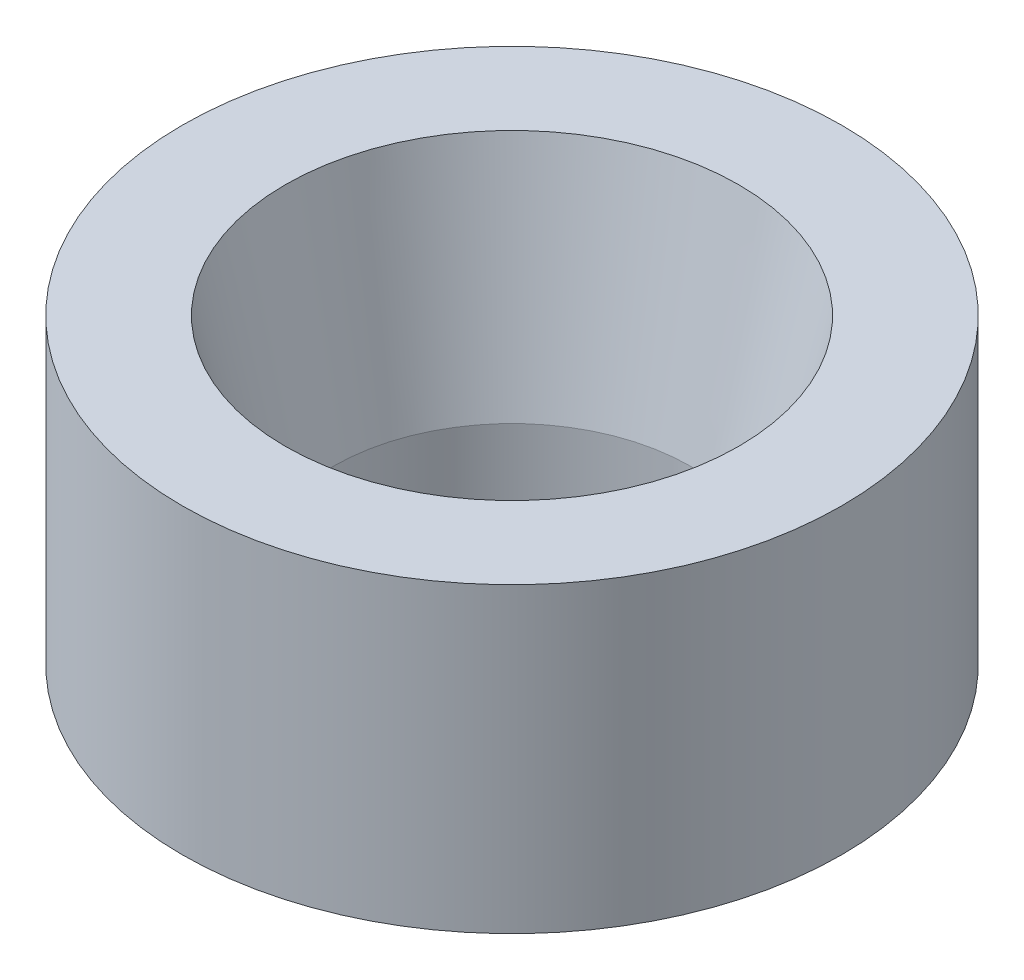
ISO-10303-21;
HEADER;
FILE_DESCRIPTION(('STEP AP214'),'2;1');
FILE_NAME('part.step','',(''),(''),'','','');
FILE_SCHEMA(('AUTOMOTIVE_DESIGN { 1 0 10303 214 1 1 1 1 }'));
ENDSEC;
DATA;
#1=APPLICATION_CONTEXT('core data for automotive mechanical design processes');
#2=APPLICATION_PROTOCOL_DEFINITION('international standard','automotive_design',2000,#1);
#3=PRODUCT_CONTEXT('',#1,'mechanical');
#4=PRODUCT('Part','Part','',(#3));
#5=PRODUCT_RELATED_PRODUCT_CATEGORY('part','',(#4));
#6=PRODUCT_DEFINITION_FORMATION('','',#4);
#7=PRODUCT_DEFINITION_CONTEXT('part definition',#1,'design');
#8=PRODUCT_DEFINITION('design','',#6,#7);
#9=PRODUCT_DEFINITION_SHAPE('','',#8);
#10=(LENGTH_UNIT() NAMED_UNIT(*) SI_UNIT(.MILLI.,.METRE.));
#11=(NAMED_UNIT(*) PLANE_ANGLE_UNIT() SI_UNIT($,.RADIAN.));
#12=(NAMED_UNIT(*) SI_UNIT($,.STERADIAN.) SOLID_ANGLE_UNIT());
#13=UNCERTAINTY_MEASURE_WITH_UNIT(LENGTH_MEASURE(1.E-05),#10,'distance_accuracy_value','');
#14=(GEOMETRIC_REPRESENTATION_CONTEXT(3) GLOBAL_UNCERTAINTY_ASSIGNED_CONTEXT((#13)) GLOBAL_UNIT_ASSIGNED_CONTEXT((#10,
#11,#12)) REPRESENTATION_CONTEXT('',''));
#15=CARTESIAN_POINT('',(0.,0.,0.));
#16=DIRECTION('',(0.,0.,1.));
#17=DIRECTION('',(1.,0.,0.));
#18=AXIS2_PLACEMENT_3D('',#15,#16,#17);
#19=CARTESIAN_POINT('',(24.,0.,0.));
#20=DIRECTION('',(0.,1.,0.));
#21=DIRECTION('',(0.,0.,1.));
#22=AXIS2_PLACEMENT_3D('',#19,#20,#21);
#23=PLANE('',#22);
#24=CARTESIAN_POINT('',(0.,0.,0.));
#25=DIRECTION('',(0.,1.,0.));
#26=DIRECTION('',(0.,0.,1.));
#27=AXIS2_PLACEMENT_3D('',#24,#25,#26);
#28=CIRCLE('',#27,24.);
#29=CARTESIAN_POINT('',(0.,0.,24.));
#30=VERTEX_POINT('',#29);
#31=EDGE_CURVE('E54',#30,#30,#28,.T.);
#32=ORIENTED_EDGE('',*,*,#31,.F.);
#33=EDGE_LOOP('',(#32));
#34=FACE_BOUND('',#33,.T.);
#35=CARTESIAN_POINT('',(0.,0.,0.));
#36=DIRECTION('',(0.,1.,0.));
#37=DIRECTION('',(0.,0.,1.));
#38=AXIS2_PLACEMENT_3D('',#35,#36,#37);
#39=CIRCLE('',#38,13.);
#40=CARTESIAN_POINT('',(0.,0.,13.));
#41=VERTEX_POINT('',#40);
#42=EDGE_CURVE('E10',#41,#41,#39,.T.);
#43=ORIENTED_EDGE('',*,*,#42,.T.);
#44=EDGE_LOOP('',(#43));
#45=FACE_BOUND('',#44,.T.);
#46=ADVANCED_FACE('F35',(#34,#45),#23,.F.);
#47=CARTESIAN_POINT('',(0.,34.5536723163842,0.));
#48=DIRECTION('',(0.,1.,0.));
#49=DIRECTION('',(0.,0.,1.));
#50=AXIS2_PLACEMENT_3D('',#47,#48,#49);
#51=CYLINDRICAL_SURFACE('',#50,13.);
#52=ORIENTED_EDGE('',*,*,#42,.F.);
#53=EDGE_LOOP('',(#52));
#54=FACE_BOUND('',#53,.T.);
#55=CARTESIAN_POINT('',(0.,6.00000000000001,0.));
#56=DIRECTION('',(0.,1.,0.));
#57=DIRECTION('',(0.,0.,1.));
#58=AXIS2_PLACEMENT_3D('',#55,#56,#57);
#59=CIRCLE('',#58,13.);
#60=CARTESIAN_POINT('',(0.,6.00000000000001,13.));
#61=VERTEX_POINT('',#60);
#62=EDGE_CURVE('E41',#61,#61,#59,.T.);
#63=ORIENTED_EDGE('',*,*,#62,.T.);
#64=EDGE_LOOP('',(#63));
#65=FACE_BOUND('',#64,.T.);
#66=ADVANCED_FACE('F61',(#54,#65),#51,.F.);
#67=CARTESIAN_POINT('',(0.,22.,0.));
#68=DIRECTION('',(0.,1.,0.));
#69=DIRECTION('',(0.,0.,1.));
#70=AXIS2_PLACEMENT_3D('',#67,#68,#69);
#71=CONICAL_SURFACE('',#70,16.5,0.215357699697738);
#72=ORIENTED_EDGE('',*,*,#62,.F.);
#73=EDGE_LOOP('',(#72));
#74=FACE_BOUND('',#73,.T.);
#75=CARTESIAN_POINT('',(0.,22.,0.));
#76=DIRECTION('',(0.,1.,0.));
#77=DIRECTION('',(0.,0.,1.));
#78=AXIS2_PLACEMENT_3D('',#75,#76,#77);
#79=CIRCLE('',#78,16.5);
#80=CARTESIAN_POINT('',(0.,22.,16.5));
#81=VERTEX_POINT('',#80);
#82=EDGE_CURVE('E45',#81,#81,#79,.T.);
#83=ORIENTED_EDGE('',*,*,#82,.T.);
#84=EDGE_LOOP('',(#83));
#85=FACE_BOUND('',#84,.T.);
#86=ADVANCED_FACE('F65',(#74,#85),#71,.F.);
#87=CARTESIAN_POINT('',(16.5,22.,0.));
#88=DIRECTION('',(0.,-1.,0.));
#89=DIRECTION('',(0.,0.,-1.));
#90=AXIS2_PLACEMENT_3D('',#87,#88,#89);
#91=PLANE('',#90);
#92=ORIENTED_EDGE('',*,*,#82,.F.);
#93=EDGE_LOOP('',(#92));
#94=FACE_BOUND('',#93,.T.);
#95=CARTESIAN_POINT('',(0.,22.,0.));
#96=DIRECTION('',(0.,1.,0.));
#97=DIRECTION('',(0.,0.,1.));
#98=AXIS2_PLACEMENT_3D('',#95,#96,#97);
#99=CIRCLE('',#98,24.);
#100=CARTESIAN_POINT('',(0.,22.,24.));
#101=VERTEX_POINT('',#100);
#102=EDGE_CURVE('E49',#101,#101,#99,.T.);
#103=ORIENTED_EDGE('',*,*,#102,.T.);
#104=EDGE_LOOP('',(#103));
#105=FACE_BOUND('',#104,.T.);
#106=ADVANCED_FACE('F70',(#94,#105),#91,.F.);
#107=CARTESIAN_POINT('',(0.,34.5536723163842,0.));
#108=DIRECTION('',(0.,1.,0.));
#109=DIRECTION('',(0.,0.,1.));
#110=AXIS2_PLACEMENT_3D('',#107,#108,#109);
#111=CYLINDRICAL_SURFACE('',#110,24.);
#112=ORIENTED_EDGE('',*,*,#102,.F.);
#113=EDGE_LOOP('',(#112));
#114=FACE_BOUND('',#113,.T.);
#115=ORIENTED_EDGE('',*,*,#31,.T.);
#116=EDGE_LOOP('',(#115));
#117=FACE_BOUND('',#116,.T.);
#118=ADVANCED_FACE('F58',(#114,#117),#111,.T.);
#119=CLOSED_SHELL('',(#46,#66,#86,#106,#118));
#120=MANIFOLD_SOLID_BREP('B2',#119);
#121=ADVANCED_BREP_SHAPE_REPRESENTATION('',(#18,#120),#14);
#122=SHAPE_DEFINITION_REPRESENTATION(#9,#121);
ENDSEC;
END-ISO-10303-21;
